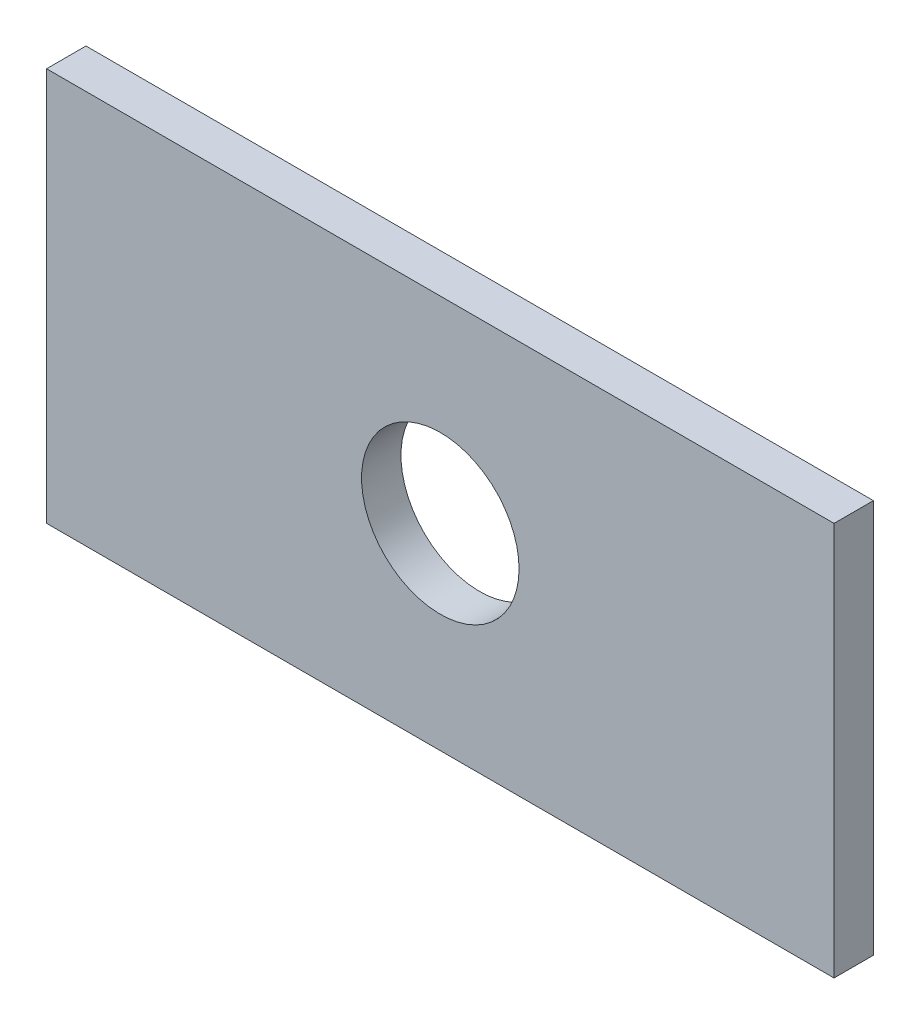
ISO-10303-21;
HEADER;
FILE_DESCRIPTION(('STEP AP214'),'2;1');
FILE_NAME('part.step','',(''),(''),'','','');
FILE_SCHEMA(('AUTOMOTIVE_DESIGN { 1 0 10303 214 1 1 1 1 }'));
ENDSEC;
DATA;
#1=APPLICATION_CONTEXT('core data for automotive mechanical design processes');
#2=APPLICATION_PROTOCOL_DEFINITION('international standard','automotive_design',2000,#1);
#3=PRODUCT_CONTEXT('',#1,'mechanical');
#4=PRODUCT('Part','Part','',(#3));
#5=PRODUCT_RELATED_PRODUCT_CATEGORY('part','',(#4));
#6=PRODUCT_DEFINITION_FORMATION('','',#4);
#7=PRODUCT_DEFINITION_CONTEXT('part definition',#1,'design');
#8=PRODUCT_DEFINITION('design','',#6,#7);
#9=PRODUCT_DEFINITION_SHAPE('','',#8);
#10=(LENGTH_UNIT() NAMED_UNIT(*) SI_UNIT(.MILLI.,.METRE.));
#11=(NAMED_UNIT(*) PLANE_ANGLE_UNIT() SI_UNIT($,.RADIAN.));
#12=(NAMED_UNIT(*) SI_UNIT($,.STERADIAN.) SOLID_ANGLE_UNIT());
#13=UNCERTAINTY_MEASURE_WITH_UNIT(LENGTH_MEASURE(1.E-05),#10,'distance_accuracy_value','');
#14=(GEOMETRIC_REPRESENTATION_CONTEXT(3) GLOBAL_UNCERTAINTY_ASSIGNED_CONTEXT((#13)) GLOBAL_UNIT_ASSIGNED_CONTEXT((#10,
#11,#12)) REPRESENTATION_CONTEXT('',''));
#15=CARTESIAN_POINT('',(0.,0.,0.));
#16=DIRECTION('',(0.,0.,1.));
#17=DIRECTION('',(1.,0.,0.));
#18=AXIS2_PLACEMENT_3D('',#15,#16,#17);
#19=CARTESIAN_POINT('',(0.,0.,10.));
#20=DIRECTION('',(0.,0.,1.));
#21=DIRECTION('',(1.,0.,0.));
#22=AXIS2_PLACEMENT_3D('',#19,#20,#21);
#23=PLANE('',#22);
#24=DIRECTION('',(0.,-1.,0.));
#25=VECTOR('',#24,1.);
#26=CARTESIAN_POINT('',(-100.,-50.,10.));
#27=LINE('',#26,#25);
#28=CARTESIAN_POINT('',(-100.,50.,10.));
#29=VERTEX_POINT('',#28);
#30=CARTESIAN_POINT('',(-100.,-50.,10.));
#31=VERTEX_POINT('',#30);
#32=EDGE_CURVE('E91',#29,#31,#27,.T.);
#33=ORIENTED_EDGE('',*,*,#32,.T.);
#34=DIRECTION('',(1.,0.,0.));
#35=VECTOR('',#34,1.);
#36=CARTESIAN_POINT('',(100.,-50.,10.));
#37=LINE('',#36,#35);
#38=CARTESIAN_POINT('',(100.,-50.,10.));
#39=VERTEX_POINT('',#38);
#40=EDGE_CURVE('E86',#31,#39,#37,.T.);
#41=ORIENTED_EDGE('',*,*,#40,.T.);
#42=DIRECTION('',(0.,1.,0.));
#43=VECTOR('',#42,1.);
#44=CARTESIAN_POINT('',(100.,-50.,10.));
#45=LINE('',#44,#43);
#46=CARTESIAN_POINT('',(100.,50.,10.));
#47=VERTEX_POINT('',#46);
#48=EDGE_CURVE('E89',#39,#47,#45,.T.);
#49=ORIENTED_EDGE('',*,*,#48,.T.);
#50=DIRECTION('',(-1.,0.,0.));
#51=VECTOR('',#50,1.);
#52=CARTESIAN_POINT('',(100.,50.,10.));
#53=LINE('',#52,#51);
#54=EDGE_CURVE('E56',#47,#29,#53,.T.);
#55=ORIENTED_EDGE('',*,*,#54,.T.);
#56=EDGE_LOOP('',(#33,#41,#49,#55));
#57=FACE_BOUND('',#56,.T.);
#58=CARTESIAN_POINT('',(0.,0.,10.));
#59=DIRECTION('',(0.,0.,1.));
#60=DIRECTION('',(1.,0.,0.));
#61=AXIS2_PLACEMENT_3D('',#58,#59,#60);
#62=CIRCLE('',#61,20.);
#63=CARTESIAN_POINT('',(20.0000000000001,0.,10.));
#64=VERTEX_POINT('',#63);
#65=EDGE_CURVE('E109',#64,#64,#62,.T.);
#66=ORIENTED_EDGE('',*,*,#65,.F.);
#67=EDGE_LOOP('',(#66));
#68=FACE_BOUND('',#67,.T.);
#69=ADVANCED_FACE('F39',(#57,#68),#23,.T.);
#70=CARTESIAN_POINT('',(0.,0.,0.));
#71=DIRECTION('',(0.,0.,1.));
#72=DIRECTION('',(1.,0.,0.));
#73=AXIS2_PLACEMENT_3D('',#70,#71,#72);
#74=PLANE('',#73);
#75=DIRECTION('',(0.,-1.,0.));
#76=VECTOR('',#75,1.);
#77=CARTESIAN_POINT('',(-100.,-50.,0.));
#78=LINE('',#77,#76);
#79=CARTESIAN_POINT('',(-100.,50.,0.));
#80=VERTEX_POINT('',#79);
#81=CARTESIAN_POINT('',(-100.,-50.,0.));
#82=VERTEX_POINT('',#81);
#83=EDGE_CURVE('E113',#80,#82,#78,.T.);
#84=ORIENTED_EDGE('',*,*,#83,.F.);
#85=DIRECTION('',(-1.,0.,0.));
#86=VECTOR('',#85,1.);
#87=CARTESIAN_POINT('',(100.,50.,0.));
#88=LINE('',#87,#86);
#89=CARTESIAN_POINT('',(100.,50.,0.));
#90=VERTEX_POINT('',#89);
#91=EDGE_CURVE('E79',#90,#80,#88,.T.);
#92=ORIENTED_EDGE('',*,*,#91,.F.);
#93=DIRECTION('',(0.,1.,0.));
#94=VECTOR('',#93,1.);
#95=CARTESIAN_POINT('',(100.,-50.,0.));
#96=LINE('',#95,#94);
#97=CARTESIAN_POINT('',(100.,-50.,0.));
#98=VERTEX_POINT('',#97);
#99=EDGE_CURVE('E73',#98,#90,#96,.T.);
#100=ORIENTED_EDGE('',*,*,#99,.F.);
#101=DIRECTION('',(1.,0.,0.));
#102=VECTOR('',#101,1.);
#103=CARTESIAN_POINT('',(100.,-50.,0.));
#104=LINE('',#103,#102);
#105=EDGE_CURVE('E95',#82,#98,#104,.T.);
#106=ORIENTED_EDGE('',*,*,#105,.F.);
#107=EDGE_LOOP('',(#84,#92,#100,#106));
#108=FACE_BOUND('',#107,.T.);
#109=CARTESIAN_POINT('',(0.,0.,0.));
#110=DIRECTION('',(0.,0.,1.));
#111=DIRECTION('',(1.,0.,0.));
#112=AXIS2_PLACEMENT_3D('',#109,#110,#111);
#113=CIRCLE('',#112,20.);
#114=CARTESIAN_POINT('',(20.0000000000001,0.,0.));
#115=VERTEX_POINT('',#114);
#116=EDGE_CURVE('E114',#115,#115,#113,.T.);
#117=ORIENTED_EDGE('',*,*,#116,.T.);
#118=EDGE_LOOP('',(#117));
#119=FACE_BOUND('',#118,.T.);
#120=ADVANCED_FACE('F128',(#108,#119),#74,.F.);
#121=CARTESIAN_POINT('',(-100.,-50.,10.));
#122=DIRECTION('',(1.,0.,0.));
#123=DIRECTION('',(0.,0.,-1.));
#124=AXIS2_PLACEMENT_3D('',#121,#122,#123);
#125=PLANE('',#124);
#126=ORIENTED_EDGE('',*,*,#83,.T.);
#127=DIRECTION('',(0.,0.,-1.));
#128=VECTOR('',#127,1.);
#129=CARTESIAN_POINT('',(-100.,-50.,10.));
#130=LINE('',#129,#128);
#131=EDGE_CURVE('E12',#31,#82,#130,.T.);
#132=ORIENTED_EDGE('',*,*,#131,.F.);
#133=ORIENTED_EDGE('',*,*,#32,.F.);
#134=DIRECTION('',(0.,0.,-1.));
#135=VECTOR('',#134,1.);
#136=CARTESIAN_POINT('',(-100.,50.,10.));
#137=LINE('',#136,#135);
#138=EDGE_CURVE('E99',#29,#80,#137,.T.);
#139=ORIENTED_EDGE('',*,*,#138,.T.);
#140=EDGE_LOOP('',(#126,#132,#133,#139));
#141=FACE_BOUND('',#140,.T.);
#142=ADVANCED_FACE('F41',(#141),#125,.F.);
#143=CARTESIAN_POINT('',(100.,-50.,10.));
#144=DIRECTION('',(0.,1.,0.));
#145=DIRECTION('',(-1.,0.,0.));
#146=AXIS2_PLACEMENT_3D('',#143,#144,#145);
#147=PLANE('',#146);
#148=ORIENTED_EDGE('',*,*,#105,.T.);
#149=DIRECTION('',(0.,0.,-1.));
#150=VECTOR('',#149,1.);
#151=CARTESIAN_POINT('',(100.,-50.,10.));
#152=LINE('',#151,#150);
#153=EDGE_CURVE('E48',#39,#98,#152,.T.);
#154=ORIENTED_EDGE('',*,*,#153,.F.);
#155=ORIENTED_EDGE('',*,*,#40,.F.);
#156=ORIENTED_EDGE('',*,*,#131,.T.);
#157=EDGE_LOOP('',(#148,#154,#155,#156));
#158=FACE_BOUND('',#157,.T.);
#159=ADVANCED_FACE('F94',(#158),#147,.F.);
#160=CARTESIAN_POINT('',(100.,-50.,10.));
#161=DIRECTION('',(-1.,0.,0.));
#162=DIRECTION('',(0.,0.,1.));
#163=AXIS2_PLACEMENT_3D('',#160,#161,#162);
#164=PLANE('',#163);
#165=ORIENTED_EDGE('',*,*,#99,.T.);
#166=DIRECTION('',(0.,0.,-1.));
#167=VECTOR('',#166,1.);
#168=CARTESIAN_POINT('',(100.,50.,10.));
#169=LINE('',#168,#167);
#170=EDGE_CURVE('E96',#47,#90,#169,.T.);
#171=ORIENTED_EDGE('',*,*,#170,.F.);
#172=ORIENTED_EDGE('',*,*,#48,.F.);
#173=ORIENTED_EDGE('',*,*,#153,.T.);
#174=EDGE_LOOP('',(#165,#171,#172,#173));
#175=FACE_BOUND('',#174,.T.);
#176=ADVANCED_FACE('F97',(#175),#164,.F.);
#177=CARTESIAN_POINT('',(100.,50.,10.));
#178=DIRECTION('',(0.,-1.,0.));
#179=DIRECTION('',(1.,0.,0.));
#180=AXIS2_PLACEMENT_3D('',#177,#178,#179);
#181=PLANE('',#180);
#182=ORIENTED_EDGE('',*,*,#91,.T.);
#183=ORIENTED_EDGE('',*,*,#138,.F.);
#184=ORIENTED_EDGE('',*,*,#54,.F.);
#185=ORIENTED_EDGE('',*,*,#170,.T.);
#186=EDGE_LOOP('',(#182,#183,#184,#185));
#187=FACE_BOUND('',#186,.T.);
#188=ADVANCED_FACE('F125',(#187),#181,.F.);
#189=CARTESIAN_POINT('',(0.,0.,10.));
#190=DIRECTION('',(0.,0.,-1.));
#191=DIRECTION('',(-1.,0.,0.));
#192=AXIS2_PLACEMENT_3D('',#189,#190,#191);
#193=CYLINDRICAL_SURFACE('',#192,20.);
#194=ORIENTED_EDGE('',*,*,#65,.T.);
#195=EDGE_LOOP('',(#194));
#196=FACE_BOUND('',#195,.T.);
#197=ORIENTED_EDGE('',*,*,#116,.F.);
#198=EDGE_LOOP('',(#197));
#199=FACE_BOUND('',#198,.T.);
#200=ADVANCED_FACE('F142',(#196,#199),#193,.F.);
#201=CLOSED_SHELL('',(#69,#120,#142,#159,#176,#188,#200));
#202=MANIFOLD_SOLID_BREP('B2',#201);
#203=ADVANCED_BREP_SHAPE_REPRESENTATION('',(#18,#202),#14);
#204=SHAPE_DEFINITION_REPRESENTATION(#9,#203);
ENDSEC;
END-ISO-10303-21;
